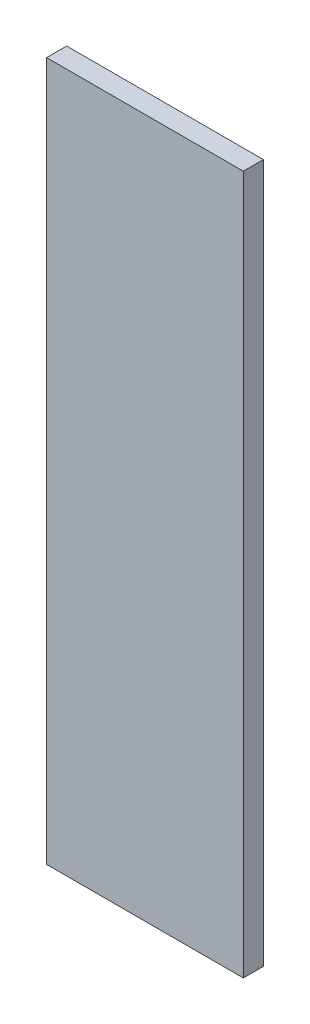
ISO-10303-21;
HEADER;
FILE_DESCRIPTION(('STEP AP214'),'2;1');
FILE_NAME('part.step','',(''),(''),'','','');
FILE_SCHEMA(('AUTOMOTIVE_DESIGN { 1 0 10303 214 1 1 1 1 }'));
ENDSEC;
DATA;
#1=APPLICATION_CONTEXT('core data for automotive mechanical design processes');
#2=APPLICATION_PROTOCOL_DEFINITION('international standard','automotive_design',2000,#1);
#3=PRODUCT_CONTEXT('',#1,'mechanical');
#4=PRODUCT('Part','Part','',(#3));
#5=PRODUCT_RELATED_PRODUCT_CATEGORY('part','',(#4));
#6=PRODUCT_DEFINITION_FORMATION('','',#4);
#7=PRODUCT_DEFINITION_CONTEXT('part definition',#1,'design');
#8=PRODUCT_DEFINITION('design','',#6,#7);
#9=PRODUCT_DEFINITION_SHAPE('','',#8);
#10=(LENGTH_UNIT() NAMED_UNIT(*) SI_UNIT(.MILLI.,.METRE.));
#11=(NAMED_UNIT(*) PLANE_ANGLE_UNIT() SI_UNIT($,.RADIAN.));
#12=(NAMED_UNIT(*) SI_UNIT($,.STERADIAN.) SOLID_ANGLE_UNIT());
#13=UNCERTAINTY_MEASURE_WITH_UNIT(LENGTH_MEASURE(1.E-05),#10,'distance_accuracy_value','');
#14=(GEOMETRIC_REPRESENTATION_CONTEXT(3) GLOBAL_UNCERTAINTY_ASSIGNED_CONTEXT((#13)) GLOBAL_UNIT_ASSIGNED_CONTEXT((#10,
#11,#12)) REPRESENTATION_CONTEXT('',''));
#15=CARTESIAN_POINT('',(0.,0.,0.));
#16=DIRECTION('',(0.,0.,1.));
#17=DIRECTION('',(1.,0.,0.));
#18=AXIS2_PLACEMENT_3D('',#15,#16,#17);
#19=CARTESIAN_POINT('',(0.,0.,-0.0500000000000001));
#20=DIRECTION('',(0.,0.,-1.));
#21=DIRECTION('',(-1.,0.,0.));
#22=AXIS2_PLACEMENT_3D('',#19,#20,#21);
#23=PLANE('',#22);
#24=DIRECTION('',(1.,0.,0.));
#25=VECTOR('',#24,1.);
#26=CARTESIAN_POINT('',(-0.22,0.87,-0.0500000000000001));
#27=LINE('',#26,#25);
#28=CARTESIAN_POINT('',(-0.25,0.87,-0.0500000000000001));
#29=VERTEX_POINT('',#28);
#30=CARTESIAN_POINT('',(0.24,0.87,-0.0500000000000001));
#31=VERTEX_POINT('',#30);
#32=EDGE_CURVE('E99',#29,#31,#27,.T.);
#33=ORIENTED_EDGE('',*,*,#32,.T.);
#34=DIRECTION('',(0.,1.,0.));
#35=VECTOR('',#34,1.);
#36=CARTESIAN_POINT('',(0.24,-0.87,-0.0500000000000001));
#37=LINE('',#36,#35);
#38=CARTESIAN_POINT('',(0.24,-0.87,-0.0500000000000001));
#39=VERTEX_POINT('',#38);
#40=EDGE_CURVE('E68',#39,#31,#37,.T.);
#41=ORIENTED_EDGE('',*,*,#40,.F.);
#42=DIRECTION('',(-1.,0.,0.));
#43=VECTOR('',#42,1.);
#44=CARTESIAN_POINT('',(0.22,-0.87,-0.0500000000000001));
#45=LINE('',#44,#43);
#46=CARTESIAN_POINT('',(-0.25,-0.87,-0.0499999999999999));
#47=VERTEX_POINT('',#46);
#48=EDGE_CURVE('E64',#39,#47,#45,.T.);
#49=ORIENTED_EDGE('',*,*,#48,.T.);
#50=DIRECTION('',(0.,-1.,0.));
#51=VECTOR('',#50,1.);
#52=CARTESIAN_POINT('',(-0.25,0.87,-0.0500000000000001));
#53=LINE('',#52,#51);
#54=EDGE_CURVE('E41',#29,#47,#53,.T.);
#55=ORIENTED_EDGE('',*,*,#54,.F.);
#56=EDGE_LOOP('',(#33,#41,#49,#55));
#57=FACE_BOUND('',#56,.T.);
#58=ADVANCED_FACE('F33',(#57),#23,.T.);
#59=CARTESIAN_POINT('',(0.,0.,0.));
#60=DIRECTION('',(0.,0.,1.));
#61=DIRECTION('',(1.,0.,0.));
#62=AXIS2_PLACEMENT_3D('',#59,#60,#61);
#63=PLANE('',#62);
#64=DIRECTION('',(0.,-1.,0.));
#65=VECTOR('',#64,1.);
#66=CARTESIAN_POINT('',(-0.25,0.87,0.));
#67=LINE('',#66,#65);
#68=CARTESIAN_POINT('',(-0.25,0.87,0.));
#69=VERTEX_POINT('',#68);
#70=CARTESIAN_POINT('',(-0.25,-0.87,0.));
#71=VERTEX_POINT('',#70);
#72=EDGE_CURVE('E91',#69,#71,#67,.T.);
#73=ORIENTED_EDGE('',*,*,#72,.T.);
#74=DIRECTION('',(1.,0.,0.));
#75=VECTOR('',#74,1.);
#76=CARTESIAN_POINT('',(-0.25,-0.87,0.));
#77=LINE('',#76,#75);
#78=CARTESIAN_POINT('',(0.24,-0.87,0.));
#79=VERTEX_POINT('',#78);
#80=EDGE_CURVE('E81',#71,#79,#77,.T.);
#81=ORIENTED_EDGE('',*,*,#80,.T.);
#82=DIRECTION('',(0.,1.,0.));
#83=VECTOR('',#82,1.);
#84=CARTESIAN_POINT('',(0.24,-0.87,0.));
#85=LINE('',#84,#83);
#86=CARTESIAN_POINT('',(0.24,0.87,0.));
#87=VERTEX_POINT('',#86);
#88=EDGE_CURVE('E84',#79,#87,#85,.T.);
#89=ORIENTED_EDGE('',*,*,#88,.T.);
#90=DIRECTION('',(-1.,0.,0.));
#91=VECTOR('',#90,1.);
#92=CARTESIAN_POINT('',(0.24,0.87,0.));
#93=LINE('',#92,#91);
#94=EDGE_CURVE('E83',#87,#69,#93,.T.);
#95=ORIENTED_EDGE('',*,*,#94,.T.);
#96=EDGE_LOOP('',(#73,#81,#89,#95));
#97=FACE_BOUND('',#96,.T.);
#98=ADVANCED_FACE('F90',(#97),#63,.T.);
#99=CARTESIAN_POINT('',(-0.25,-0.87,-1.85767806868369));
#100=DIRECTION('',(0.,-1.,0.));
#101=DIRECTION('',(0.,0.,-1.));
#102=AXIS2_PLACEMENT_3D('',#99,#100,#101);
#103=PLANE('',#102);
#104=DIRECTION('',(0.,0.,1.));
#105=VECTOR('',#104,1.);
#106=CARTESIAN_POINT('',(-0.25,-0.87,-1.85767806868369));
#107=LINE('',#106,#105);
#108=EDGE_CURVE('E11',#47,#71,#107,.T.);
#109=ORIENTED_EDGE('',*,*,#108,.F.);
#110=ORIENTED_EDGE('',*,*,#48,.F.);
#111=DIRECTION('',(0.,0.,1.));
#112=VECTOR('',#111,1.);
#113=CARTESIAN_POINT('',(0.24,-0.87,-1.85767806868369));
#114=LINE('',#113,#112);
#115=EDGE_CURVE('E78',#39,#79,#114,.T.);
#116=ORIENTED_EDGE('',*,*,#115,.T.);
#117=ORIENTED_EDGE('',*,*,#80,.F.);
#118=EDGE_LOOP('',(#109,#110,#116,#117));
#119=FACE_BOUND('',#118,.T.);
#120=ADVANCED_FACE('F79',(#119),#103,.T.);
#121=CARTESIAN_POINT('',(0.24,-0.87,-1.85767806868369));
#122=DIRECTION('',(1.,0.,0.));
#123=DIRECTION('',(0.,0.,-1.));
#124=AXIS2_PLACEMENT_3D('',#121,#122,#123);
#125=PLANE('',#124);
#126=ORIENTED_EDGE('',*,*,#115,.F.);
#127=ORIENTED_EDGE('',*,*,#40,.T.);
#128=DIRECTION('',(0.,0.,1.));
#129=VECTOR('',#128,1.);
#130=CARTESIAN_POINT('',(0.24,0.87,-1.85767806868369));
#131=LINE('',#130,#129);
#132=EDGE_CURVE('E74',#31,#87,#131,.T.);
#133=ORIENTED_EDGE('',*,*,#132,.T.);
#134=ORIENTED_EDGE('',*,*,#88,.F.);
#135=EDGE_LOOP('',(#126,#127,#133,#134));
#136=FACE_BOUND('',#135,.T.);
#137=ADVANCED_FACE('F85',(#136),#125,.T.);
#138=CARTESIAN_POINT('',(0.24,0.87,-1.85767806868369));
#139=DIRECTION('',(0.,1.,0.));
#140=DIRECTION('',(0.,0.,1.));
#141=AXIS2_PLACEMENT_3D('',#138,#139,#140);
#142=PLANE('',#141);
#143=ORIENTED_EDGE('',*,*,#132,.F.);
#144=ORIENTED_EDGE('',*,*,#32,.F.);
#145=DIRECTION('',(0.,0.,1.));
#146=VECTOR('',#145,1.);
#147=CARTESIAN_POINT('',(-0.25,0.87,-1.85767806868369));
#148=LINE('',#147,#146);
#149=EDGE_CURVE('E97',#29,#69,#148,.T.);
#150=ORIENTED_EDGE('',*,*,#149,.T.);
#151=ORIENTED_EDGE('',*,*,#94,.F.);
#152=EDGE_LOOP('',(#143,#144,#150,#151));
#153=FACE_BOUND('',#152,.T.);
#154=ADVANCED_FACE('F106',(#153),#142,.T.);
#155=CARTESIAN_POINT('',(-0.25,0.87,-1.85767806868369));
#156=DIRECTION('',(-1.,0.,0.));
#157=DIRECTION('',(0.,-1.,0.));
#158=AXIS2_PLACEMENT_3D('',#155,#156,#157);
#159=PLANE('',#158);
#160=ORIENTED_EDGE('',*,*,#149,.F.);
#161=ORIENTED_EDGE('',*,*,#54,.T.);
#162=ORIENTED_EDGE('',*,*,#108,.T.);
#163=ORIENTED_EDGE('',*,*,#72,.F.);
#164=EDGE_LOOP('',(#160,#161,#162,#163));
#165=FACE_BOUND('',#164,.T.);
#166=ADVANCED_FACE('F107',(#165),#159,.T.);
#167=CLOSED_SHELL('',(#58,#98,#120,#137,#154,#166));
#168=MANIFOLD_SOLID_BREP('B2',#167);
#169=ADVANCED_BREP_SHAPE_REPRESENTATION('',(#18,#168),#14);
#170=SHAPE_DEFINITION_REPRESENTATION(#9,#169);
ENDSEC;
END-ISO-10303-21;
